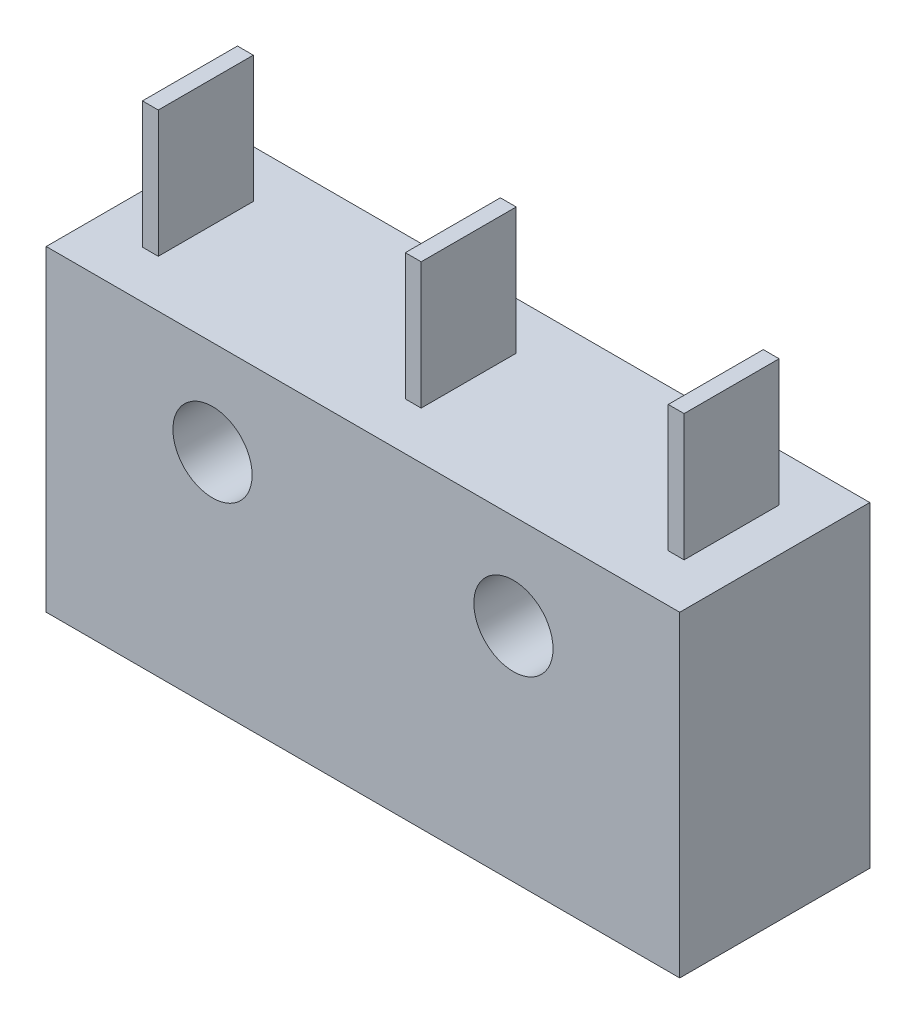
ISO-10303-21;
HEADER;
FILE_DESCRIPTION(('STEP AP214'),'2;1');
FILE_NAME('part.step','',(''),(''),'','','');
FILE_SCHEMA(('AUTOMOTIVE_DESIGN { 1 0 10303 214 1 1 1 1 }'));
ENDSEC;
DATA;
#1=APPLICATION_CONTEXT('core data for automotive mechanical design processes');
#2=APPLICATION_PROTOCOL_DEFINITION('international standard','automotive_design',2000,#1);
#3=PRODUCT_CONTEXT('',#1,'mechanical');
#4=PRODUCT('Part','Part','',(#3));
#5=PRODUCT_RELATED_PRODUCT_CATEGORY('part','',(#4));
#6=PRODUCT_DEFINITION_FORMATION('','',#4);
#7=PRODUCT_DEFINITION_CONTEXT('part definition',#1,'design');
#8=PRODUCT_DEFINITION('design','',#6,#7);
#9=PRODUCT_DEFINITION_SHAPE('','',#8);
#10=(LENGTH_UNIT() NAMED_UNIT(*) SI_UNIT(.MILLI.,.METRE.));
#11=(NAMED_UNIT(*) PLANE_ANGLE_UNIT() SI_UNIT($,.RADIAN.));
#12=(NAMED_UNIT(*) SI_UNIT($,.STERADIAN.) SOLID_ANGLE_UNIT());
#13=UNCERTAINTY_MEASURE_WITH_UNIT(LENGTH_MEASURE(1.E-05),#10,'distance_accuracy_value','');
#14=(GEOMETRIC_REPRESENTATION_CONTEXT(3) GLOBAL_UNCERTAINTY_ASSIGNED_CONTEXT((#13)) GLOBAL_UNIT_ASSIGNED_CONTEXT((#10,
#11,#12)) REPRESENTATION_CONTEXT('',''));
#15=CARTESIAN_POINT('',(0.,0.,0.));
#16=DIRECTION('',(0.,0.,1.));
#17=DIRECTION('',(1.,0.,0.));
#18=AXIS2_PLACEMENT_3D('',#15,#16,#17);
#19=CARTESIAN_POINT('',(-10.,5.,6.));
#20=DIRECTION('',(0.,-1.,0.));
#21=DIRECTION('',(0.,0.,-1.));
#22=AXIS2_PLACEMENT_3D('',#19,#20,#21);
#23=PLANE('',#22);
#24=DIRECTION('',(0.,0.,-1.));
#25=VECTOR('',#24,1.);
#26=CARTESIAN_POINT('',(0.337470845161732,5.,1.5));
#27=LINE('',#26,#25);
#28=CARTESIAN_POINT('',(0.337470845161732,5.,4.5));
#29=VERTEX_POINT('',#28);
#30=CARTESIAN_POINT('',(0.337470845161732,5.,1.5));
#31=VERTEX_POINT('',#30);
#32=EDGE_CURVE('E167',#29,#31,#27,.T.);
#33=ORIENTED_EDGE('',*,*,#32,.F.);
#34=DIRECTION('',(1.,0.,0.));
#35=VECTOR('',#34,1.);
#36=CARTESIAN_POINT('',(-0.162529154838269,5.,4.5));
#37=LINE('',#36,#35);
#38=CARTESIAN_POINT('',(-0.162529154838269,5.,4.5));
#39=VERTEX_POINT('',#38);
#40=EDGE_CURVE('E180',#39,#29,#37,.T.);
#41=ORIENTED_EDGE('',*,*,#40,.F.);
#42=DIRECTION('',(0.,0.,1.));
#43=VECTOR('',#42,1.);
#44=CARTESIAN_POINT('',(-0.162529154838269,5.,1.5));
#45=LINE('',#44,#43);
#46=CARTESIAN_POINT('',(-0.162529154838269,5.,1.5));
#47=VERTEX_POINT('',#46);
#48=EDGE_CURVE('E189',#47,#39,#45,.T.);
#49=ORIENTED_EDGE('',*,*,#48,.F.);
#50=DIRECTION('',(-1.,0.,0.));
#51=VECTOR('',#50,1.);
#52=CARTESIAN_POINT('',(-0.162529154838269,5.,1.5));
#53=LINE('',#52,#51);
#54=EDGE_CURVE('E170',#31,#47,#53,.T.);
#55=ORIENTED_EDGE('',*,*,#54,.F.);
#56=EDGE_LOOP('',(#33,#41,#49,#55));
#57=FACE_BOUND('',#56,.T.);
#58=DIRECTION('',(-1.,0.,0.));
#59=VECTOR('',#58,1.);
#60=CARTESIAN_POINT('',(-10.,5.,0.));
#61=LINE('',#60,#59);
#62=CARTESIAN_POINT('',(10.,5.,0.));
#63=VERTEX_POINT('',#62);
#64=CARTESIAN_POINT('',(-10.,5.,0.));
#65=VERTEX_POINT('',#64);
#66=EDGE_CURVE('E252',#63,#65,#61,.T.);
#67=ORIENTED_EDGE('',*,*,#66,.T.);
#68=DIRECTION('',(0.,0.,-1.));
#69=VECTOR('',#68,1.);
#70=CARTESIAN_POINT('',(-10.,5.,6.));
#71=LINE('',#70,#69);
#72=CARTESIAN_POINT('',(-10.,5.,6.));
#73=VERTEX_POINT('',#72);
#74=EDGE_CURVE('E41',#73,#65,#71,.T.);
#75=ORIENTED_EDGE('',*,*,#74,.F.);
#76=DIRECTION('',(-1.,0.,0.));
#77=VECTOR('',#76,1.);
#78=CARTESIAN_POINT('',(-10.,5.,6.));
#79=LINE('',#78,#77);
#80=CARTESIAN_POINT('',(10.,5.,6.));
#81=VERTEX_POINT('',#80);
#82=EDGE_CURVE('E242',#81,#73,#79,.T.);
#83=ORIENTED_EDGE('',*,*,#82,.F.);
#84=DIRECTION('',(0.,0.,-1.));
#85=VECTOR('',#84,1.);
#86=CARTESIAN_POINT('',(10.,5.,6.));
#87=LINE('',#86,#85);
#88=EDGE_CURVE('E11',#81,#63,#87,.T.);
#89=ORIENTED_EDGE('',*,*,#88,.T.);
#90=EDGE_LOOP('',(#67,#75,#83,#89));
#91=FACE_BOUND('',#90,.T.);
#92=DIRECTION('',(0.,0.,-1.));
#93=VECTOR('',#92,1.);
#94=CARTESIAN_POINT('',(-7.96252915483827,5.,1.5));
#95=LINE('',#94,#93);
#96=CARTESIAN_POINT('',(-7.96252915483827,5.,4.5));
#97=VERTEX_POINT('',#96);
#98=CARTESIAN_POINT('',(-7.96252915483827,5.,1.5));
#99=VERTEX_POINT('',#98);
#100=EDGE_CURVE('E205',#97,#99,#95,.T.);
#101=ORIENTED_EDGE('',*,*,#100,.F.);
#102=DIRECTION('',(1.,0.,0.));
#103=VECTOR('',#102,1.);
#104=CARTESIAN_POINT('',(-8.46252915483827,5.,4.5));
#105=LINE('',#104,#103);
#106=CARTESIAN_POINT('',(-8.46252915483827,5.,4.5));
#107=VERTEX_POINT('',#106);
#108=EDGE_CURVE('E210',#107,#97,#105,.T.);
#109=ORIENTED_EDGE('',*,*,#108,.F.);
#110=DIRECTION('',(0.,0.,1.));
#111=VECTOR('',#110,1.);
#112=CARTESIAN_POINT('',(-8.46252915483827,5.,1.5));
#113=LINE('',#112,#111);
#114=CARTESIAN_POINT('',(-8.46252915483827,5.,1.5));
#115=VERTEX_POINT('',#114);
#116=EDGE_CURVE('E222',#115,#107,#113,.T.);
#117=ORIENTED_EDGE('',*,*,#116,.F.);
#118=DIRECTION('',(-1.,0.,0.));
#119=VECTOR('',#118,1.);
#120=CARTESIAN_POINT('',(-8.46252915483827,5.,1.5));
#121=LINE('',#120,#119);
#122=EDGE_CURVE('E219',#99,#115,#121,.T.);
#123=ORIENTED_EDGE('',*,*,#122,.F.);
#124=EDGE_LOOP('',(#101,#109,#117,#123));
#125=FACE_BOUND('',#124,.T.);
#126=DIRECTION('',(0.,0.,-1.));
#127=VECTOR('',#126,1.);
#128=CARTESIAN_POINT('',(8.63747084516173,5.,1.5));
#129=LINE('',#128,#127);
#130=CARTESIAN_POINT('',(8.63747084516173,5.,4.5));
#131=VERTEX_POINT('',#130);
#132=CARTESIAN_POINT('',(8.63747084516173,5.,1.5));
#133=VERTEX_POINT('',#132);
#134=EDGE_CURVE('E166',#131,#133,#129,.T.);
#135=ORIENTED_EDGE('',*,*,#134,.F.);
#136=DIRECTION('',(1.,0.,0.));
#137=VECTOR('',#136,1.);
#138=CARTESIAN_POINT('',(8.13747084516173,5.,4.5));
#139=LINE('',#138,#137);
#140=CARTESIAN_POINT('',(8.13747084516173,5.,4.5));
#141=VERTEX_POINT('',#140);
#142=EDGE_CURVE('E163',#141,#131,#139,.T.);
#143=ORIENTED_EDGE('',*,*,#142,.F.);
#144=DIRECTION('',(0.,0.,1.));
#145=VECTOR('',#144,1.);
#146=CARTESIAN_POINT('',(8.13747084516173,5.,1.5));
#147=LINE('',#146,#145);
#148=CARTESIAN_POINT('',(8.13747084516173,5.,1.5));
#149=VERTEX_POINT('',#148);
#150=EDGE_CURVE('E53',#149,#141,#147,.T.);
#151=ORIENTED_EDGE('',*,*,#150,.F.);
#152=DIRECTION('',(-1.,0.,0.));
#153=VECTOR('',#152,1.);
#154=CARTESIAN_POINT('',(8.13747084516173,5.,1.5));
#155=LINE('',#154,#153);
#156=EDGE_CURVE('E48',#133,#149,#155,.T.);
#157=ORIENTED_EDGE('',*,*,#156,.F.);
#158=EDGE_LOOP('',(#135,#143,#151,#157));
#159=FACE_BOUND('',#158,.T.);
#160=ADVANCED_FACE('F33',(#57,#91,#125,#159),#23,.F.);
#161=CARTESIAN_POINT('',(10.,5.,6.));
#162=DIRECTION('',(-1.,0.,0.));
#163=DIRECTION('',(0.,-1.,0.));
#164=AXIS2_PLACEMENT_3D('',#161,#162,#163);
#165=PLANE('',#164);
#166=DIRECTION('',(0.,1.,0.));
#167=VECTOR('',#166,1.);
#168=CARTESIAN_POINT('',(10.,5.,0.));
#169=LINE('',#168,#167);
#170=CARTESIAN_POINT('',(10.,-5.,0.));
#171=VERTEX_POINT('',#170);
#172=EDGE_CURVE('E238',#171,#63,#169,.T.);
#173=ORIENTED_EDGE('',*,*,#172,.T.);
#174=ORIENTED_EDGE('',*,*,#88,.F.);
#175=DIRECTION('',(0.,1.,0.));
#176=VECTOR('',#175,1.);
#177=CARTESIAN_POINT('',(10.,5.,6.));
#178=LINE('',#177,#176);
#179=CARTESIAN_POINT('',(10.,-5.,6.));
#180=VERTEX_POINT('',#179);
#181=EDGE_CURVE('E239',#180,#81,#178,.T.);
#182=ORIENTED_EDGE('',*,*,#181,.F.);
#183=DIRECTION('',(0.,0.,-1.));
#184=VECTOR('',#183,1.);
#185=CARTESIAN_POINT('',(10.,-5.,6.));
#186=LINE('',#185,#184);
#187=EDGE_CURVE('E249',#180,#171,#186,.T.);
#188=ORIENTED_EDGE('',*,*,#187,.T.);
#189=EDGE_LOOP('',(#173,#174,#182,#188));
#190=FACE_BOUND('',#189,.T.);
#191=ADVANCED_FACE('F35',(#190),#165,.F.);
#192=CARTESIAN_POINT('',(-10.,5.,6.));
#193=DIRECTION('',(1.,0.,0.));
#194=DIRECTION('',(0.,1.,0.));
#195=AXIS2_PLACEMENT_3D('',#192,#193,#194);
#196=PLANE('',#195);
#197=DIRECTION('',(0.,-1.,0.));
#198=VECTOR('',#197,1.);
#199=CARTESIAN_POINT('',(-10.,5.,0.));
#200=LINE('',#199,#198);
#201=CARTESIAN_POINT('',(-9.99999999999999,-5.,0.));
#202=VERTEX_POINT('',#201);
#203=EDGE_CURVE('E254',#65,#202,#200,.T.);
#204=ORIENTED_EDGE('',*,*,#203,.T.);
#205=DIRECTION('',(0.,0.,-1.));
#206=VECTOR('',#205,1.);
#207=CARTESIAN_POINT('',(-9.99999999999999,-5.,6.));
#208=LINE('',#207,#206);
#209=CARTESIAN_POINT('',(-9.99999999999999,-5.,6.));
#210=VERTEX_POINT('',#209);
#211=EDGE_CURVE('E259',#210,#202,#208,.T.);
#212=ORIENTED_EDGE('',*,*,#211,.F.);
#213=DIRECTION('',(0.,-1.,0.));
#214=VECTOR('',#213,1.);
#215=CARTESIAN_POINT('',(-10.,5.,6.));
#216=LINE('',#215,#214);
#217=EDGE_CURVE('E245',#73,#210,#216,.T.);
#218=ORIENTED_EDGE('',*,*,#217,.F.);
#219=ORIENTED_EDGE('',*,*,#74,.T.);
#220=EDGE_LOOP('',(#204,#212,#218,#219));
#221=FACE_BOUND('',#220,.T.);
#222=ADVANCED_FACE('F266',(#221),#196,.F.);
#223=CARTESIAN_POINT('',(-9.99999999999999,-5.,6.));
#224=DIRECTION('',(0.,1.,0.));
#225=DIRECTION('',(0.,0.,1.));
#226=AXIS2_PLACEMENT_3D('',#223,#224,#225);
#227=PLANE('',#226);
#228=DIRECTION('',(1.,0.,0.));
#229=VECTOR('',#228,1.);
#230=CARTESIAN_POINT('',(-9.99999999999999,-5.,0.));
#231=LINE('',#230,#229);
#232=EDGE_CURVE('E243',#202,#171,#231,.T.);
#233=ORIENTED_EDGE('',*,*,#232,.T.);
#234=ORIENTED_EDGE('',*,*,#187,.F.);
#235=DIRECTION('',(1.,0.,0.));
#236=VECTOR('',#235,1.);
#237=CARTESIAN_POINT('',(-9.99999999999999,-5.,6.));
#238=LINE('',#237,#236);
#239=EDGE_CURVE('E247',#210,#180,#238,.T.);
#240=ORIENTED_EDGE('',*,*,#239,.F.);
#241=ORIENTED_EDGE('',*,*,#211,.T.);
#242=EDGE_LOOP('',(#233,#234,#240,#241));
#243=FACE_BOUND('',#242,.T.);
#244=ADVANCED_FACE('F275',(#243),#227,.F.);
#245=CARTESIAN_POINT('',(0.,0.,6.));
#246=DIRECTION('',(0.,0.,1.));
#247=DIRECTION('',(1.,0.,0.));
#248=AXIS2_PLACEMENT_3D('',#245,#246,#247);
#249=PLANE('',#248);
#250=CARTESIAN_POINT('',(-4.75,2.,6.));
#251=DIRECTION('',(0.,0.,1.));
#252=DIRECTION('',(1.,0.,0.));
#253=AXIS2_PLACEMENT_3D('',#250,#251,#252);
#254=CIRCLE('',#253,1.25);
#255=CARTESIAN_POINT('',(-3.5,2.,6.));
#256=VERTEX_POINT('',#255);
#257=EDGE_CURVE('E306',#256,#256,#254,.T.);
#258=ORIENTED_EDGE('',*,*,#257,.F.);
#259=EDGE_LOOP('',(#258));
#260=FACE_BOUND('',#259,.T.);
#261=CARTESIAN_POINT('',(4.75,2.,6.));
#262=DIRECTION('',(0.,0.,1.));
#263=DIRECTION('',(1.,0.,0.));
#264=AXIS2_PLACEMENT_3D('',#261,#262,#263);
#265=CIRCLE('',#264,1.25);
#266=CARTESIAN_POINT('',(6.,2.,6.));
#267=VERTEX_POINT('',#266);
#268=EDGE_CURVE('E300',#267,#267,#265,.T.);
#269=ORIENTED_EDGE('',*,*,#268,.F.);
#270=EDGE_LOOP('',(#269));
#271=FACE_BOUND('',#270,.T.);
#272=ORIENTED_EDGE('',*,*,#181,.T.);
#273=ORIENTED_EDGE('',*,*,#82,.T.);
#274=ORIENTED_EDGE('',*,*,#217,.T.);
#275=ORIENTED_EDGE('',*,*,#239,.T.);
#276=EDGE_LOOP('',(#272,#273,#274,#275));
#277=FACE_BOUND('',#276,.T.);
#278=ADVANCED_FACE('F281',(#260,#271,#277),#249,.T.);
#279=CARTESIAN_POINT('',(0.,0.,0.));
#280=DIRECTION('',(0.,0.,1.));
#281=DIRECTION('',(1.,0.,0.));
#282=AXIS2_PLACEMENT_3D('',#279,#280,#281);
#283=PLANE('',#282);
#284=CARTESIAN_POINT('',(-4.75,2.,0.));
#285=DIRECTION('',(0.,0.,1.));
#286=DIRECTION('',(1.,0.,0.));
#287=AXIS2_PLACEMENT_3D('',#284,#285,#286);
#288=CIRCLE('',#287,1.25);
#289=CARTESIAN_POINT('',(-3.5,2.,0.));
#290=VERTEX_POINT('',#289);
#291=EDGE_CURVE('E286',#290,#290,#288,.T.);
#292=ORIENTED_EDGE('',*,*,#291,.T.);
#293=EDGE_LOOP('',(#292));
#294=FACE_BOUND('',#293,.T.);
#295=CARTESIAN_POINT('',(4.75,2.,0.));
#296=DIRECTION('',(0.,0.,1.));
#297=DIRECTION('',(1.,0.,0.));
#298=AXIS2_PLACEMENT_3D('',#295,#296,#297);
#299=CIRCLE('',#298,1.25);
#300=CARTESIAN_POINT('',(6.,2.,0.));
#301=VERTEX_POINT('',#300);
#302=EDGE_CURVE('E303',#301,#301,#299,.T.);
#303=ORIENTED_EDGE('',*,*,#302,.T.);
#304=EDGE_LOOP('',(#303));
#305=FACE_BOUND('',#304,.T.);
#306=ORIENTED_EDGE('',*,*,#172,.F.);
#307=ORIENTED_EDGE('',*,*,#232,.F.);
#308=ORIENTED_EDGE('',*,*,#203,.F.);
#309=ORIENTED_EDGE('',*,*,#66,.F.);
#310=EDGE_LOOP('',(#306,#307,#308,#309));
#311=FACE_BOUND('',#310,.T.);
#312=ADVANCED_FACE('F272',(#294,#305,#311),#283,.F.);
#313=CARTESIAN_POINT('',(-7.96252915483827,9.,1.5));
#314=DIRECTION('',(-1.,0.,0.));
#315=DIRECTION('',(0.,0.,1.));
#316=AXIS2_PLACEMENT_3D('',#313,#314,#315);
#317=PLANE('',#316);
#318=ORIENTED_EDGE('',*,*,#100,.T.);
#319=DIRECTION('',(0.,-1.,0.));
#320=VECTOR('',#319,1.);
#321=CARTESIAN_POINT('',(-7.96252915483827,9.,1.5));
#322=LINE('',#321,#320);
#323=CARTESIAN_POINT('',(-7.96252915483827,9.,1.5));
#324=VERTEX_POINT('',#323);
#325=EDGE_CURVE('E235',#324,#99,#322,.T.);
#326=ORIENTED_EDGE('',*,*,#325,.F.);
#327=DIRECTION('',(0.,0.,-1.));
#328=VECTOR('',#327,1.);
#329=CARTESIAN_POINT('',(-7.96252915483827,9.,1.5));
#330=LINE('',#329,#328);
#331=CARTESIAN_POINT('',(-7.96252915483827,9.,4.5));
#332=VERTEX_POINT('',#331);
#333=EDGE_CURVE('E206',#332,#324,#330,.T.);
#334=ORIENTED_EDGE('',*,*,#333,.F.);
#335=DIRECTION('',(0.,-1.,0.));
#336=VECTOR('',#335,1.);
#337=CARTESIAN_POINT('',(-7.96252915483827,9.,4.5));
#338=LINE('',#337,#336);
#339=EDGE_CURVE('E216',#332,#97,#338,.T.);
#340=ORIENTED_EDGE('',*,*,#339,.T.);
#341=EDGE_LOOP('',(#318,#326,#334,#340));
#342=FACE_BOUND('',#341,.T.);
#343=ADVANCED_FACE('F380',(#342),#317,.F.);
#344=CARTESIAN_POINT('',(-8.46252915483827,9.,1.5));
#345=DIRECTION('',(0.,0.,1.));
#346=DIRECTION('',(1.,0.,0.));
#347=AXIS2_PLACEMENT_3D('',#344,#345,#346);
#348=PLANE('',#347);
#349=ORIENTED_EDGE('',*,*,#122,.T.);
#350=DIRECTION('',(0.,-1.,0.));
#351=VECTOR('',#350,1.);
#352=CARTESIAN_POINT('',(-8.46252915483827,9.,1.5));
#353=LINE('',#352,#351);
#354=CARTESIAN_POINT('',(-8.46252915483827,9.,1.5));
#355=VERTEX_POINT('',#354);
#356=EDGE_CURVE('E232',#355,#115,#353,.T.);
#357=ORIENTED_EDGE('',*,*,#356,.F.);
#358=DIRECTION('',(-1.,0.,0.));
#359=VECTOR('',#358,1.);
#360=CARTESIAN_POINT('',(-8.46252915483827,9.,1.5));
#361=LINE('',#360,#359);
#362=EDGE_CURVE('E209',#324,#355,#361,.T.);
#363=ORIENTED_EDGE('',*,*,#362,.F.);
#364=ORIENTED_EDGE('',*,*,#325,.T.);
#365=EDGE_LOOP('',(#349,#357,#363,#364));
#366=FACE_BOUND('',#365,.T.);
#367=ADVANCED_FACE('F376',(#366),#348,.F.);
#368=CARTESIAN_POINT('',(-8.46252915483827,9.,1.5));
#369=DIRECTION('',(1.,0.,0.));
#370=DIRECTION('',(0.,0.,-1.));
#371=AXIS2_PLACEMENT_3D('',#368,#369,#370);
#372=PLANE('',#371);
#373=ORIENTED_EDGE('',*,*,#116,.T.);
#374=DIRECTION('',(0.,-1.,0.));
#375=VECTOR('',#374,1.);
#376=CARTESIAN_POINT('',(-8.46252915483827,9.,4.5));
#377=LINE('',#376,#375);
#378=CARTESIAN_POINT('',(-8.46252915483827,9.,4.5));
#379=VERTEX_POINT('',#378);
#380=EDGE_CURVE('E229',#379,#107,#377,.T.);
#381=ORIENTED_EDGE('',*,*,#380,.F.);
#382=DIRECTION('',(0.,0.,1.));
#383=VECTOR('',#382,1.);
#384=CARTESIAN_POINT('',(-8.46252915483827,9.,1.5));
#385=LINE('',#384,#383);
#386=EDGE_CURVE('E212',#355,#379,#385,.T.);
#387=ORIENTED_EDGE('',*,*,#386,.F.);
#388=ORIENTED_EDGE('',*,*,#356,.T.);
#389=EDGE_LOOP('',(#373,#381,#387,#388));
#390=FACE_BOUND('',#389,.T.);
#391=ADVANCED_FACE('F372',(#390),#372,.F.);
#392=CARTESIAN_POINT('',(-8.46252915483827,9.,4.5));
#393=DIRECTION('',(0.,0.,-1.));
#394=DIRECTION('',(-1.,0.,0.));
#395=AXIS2_PLACEMENT_3D('',#392,#393,#394);
#396=PLANE('',#395);
#397=ORIENTED_EDGE('',*,*,#108,.T.);
#398=ORIENTED_EDGE('',*,*,#339,.F.);
#399=DIRECTION('',(1.,0.,0.));
#400=VECTOR('',#399,1.);
#401=CARTESIAN_POINT('',(-8.46252915483827,9.,4.5));
#402=LINE('',#401,#400);
#403=EDGE_CURVE('E214',#379,#332,#402,.T.);
#404=ORIENTED_EDGE('',*,*,#403,.F.);
#405=ORIENTED_EDGE('',*,*,#380,.T.);
#406=EDGE_LOOP('',(#397,#398,#404,#405));
#407=FACE_BOUND('',#406,.T.);
#408=ADVANCED_FACE('F368',(#407),#396,.F.);
#409=CARTESIAN_POINT('',(0.,9.,0.));
#410=DIRECTION('',(0.,1.,0.));
#411=DIRECTION('',(0.,0.,1.));
#412=AXIS2_PLACEMENT_3D('',#409,#410,#411);
#413=PLANE('',#412);
#414=ORIENTED_EDGE('',*,*,#333,.T.);
#415=ORIENTED_EDGE('',*,*,#362,.T.);
#416=ORIENTED_EDGE('',*,*,#386,.T.);
#417=ORIENTED_EDGE('',*,*,#403,.T.);
#418=EDGE_LOOP('',(#414,#415,#416,#417));
#419=FACE_BOUND('',#418,.T.);
#420=ADVANCED_FACE('F364',(#419),#413,.T.);
#421=CARTESIAN_POINT('',(0.337470845161732,9.,1.5));
#422=DIRECTION('',(-1.,0.,0.));
#423=DIRECTION('',(0.,0.,1.));
#424=AXIS2_PLACEMENT_3D('',#421,#422,#423);
#425=PLANE('',#424);
#426=ORIENTED_EDGE('',*,*,#32,.T.);
#427=DIRECTION('',(0.,-1.,0.));
#428=VECTOR('',#427,1.);
#429=CARTESIAN_POINT('',(0.337470845161732,9.,1.5));
#430=LINE('',#429,#428);
#431=CARTESIAN_POINT('',(0.337470845161732,9.,1.5));
#432=VERTEX_POINT('',#431);
#433=EDGE_CURVE('E202',#432,#31,#430,.T.);
#434=ORIENTED_EDGE('',*,*,#433,.F.);
#435=DIRECTION('',(0.,0.,-1.));
#436=VECTOR('',#435,1.);
#437=CARTESIAN_POINT('',(0.337470845161732,9.,1.5));
#438=LINE('',#437,#436);
#439=CARTESIAN_POINT('',(0.337470845161732,9.,4.5));
#440=VERTEX_POINT('',#439);
#441=EDGE_CURVE('E176',#440,#432,#438,.T.);
#442=ORIENTED_EDGE('',*,*,#441,.F.);
#443=DIRECTION('',(0.,-1.,0.));
#444=VECTOR('',#443,1.);
#445=CARTESIAN_POINT('',(0.337470845161732,9.,4.5));
#446=LINE('',#445,#444);
#447=EDGE_CURVE('E185',#440,#29,#446,.T.);
#448=ORIENTED_EDGE('',*,*,#447,.T.);
#449=EDGE_LOOP('',(#426,#434,#442,#448));
#450=FACE_BOUND('',#449,.T.);
#451=ADVANCED_FACE('F360',(#450),#425,.F.);
#452=CARTESIAN_POINT('',(-0.162529154838269,9.,1.5));
#453=DIRECTION('',(0.,0.,1.));
#454=DIRECTION('',(1.,0.,0.));
#455=AXIS2_PLACEMENT_3D('',#452,#453,#454);
#456=PLANE('',#455);
#457=ORIENTED_EDGE('',*,*,#54,.T.);
#458=DIRECTION('',(0.,-1.,0.));
#459=VECTOR('',#458,1.);
#460=CARTESIAN_POINT('',(-0.162529154838269,9.,1.5));
#461=LINE('',#460,#459);
#462=CARTESIAN_POINT('',(-0.162529154838269,9.,1.5));
#463=VERTEX_POINT('',#462);
#464=EDGE_CURVE('E199',#463,#47,#461,.T.);
#465=ORIENTED_EDGE('',*,*,#464,.F.);
#466=DIRECTION('',(-1.,0.,0.));
#467=VECTOR('',#466,1.);
#468=CARTESIAN_POINT('',(-0.162529154838269,9.,1.5));
#469=LINE('',#468,#467);
#470=EDGE_CURVE('E179',#432,#463,#469,.T.);
#471=ORIENTED_EDGE('',*,*,#470,.F.);
#472=ORIENTED_EDGE('',*,*,#433,.T.);
#473=EDGE_LOOP('',(#457,#465,#471,#472));
#474=FACE_BOUND('',#473,.T.);
#475=ADVANCED_FACE('F356',(#474),#456,.F.);
#476=CARTESIAN_POINT('',(-0.162529154838269,9.,1.5));
#477=DIRECTION('',(1.,0.,0.));
#478=DIRECTION('',(0.,0.,-1.));
#479=AXIS2_PLACEMENT_3D('',#476,#477,#478);
#480=PLANE('',#479);
#481=ORIENTED_EDGE('',*,*,#48,.T.);
#482=DIRECTION('',(0.,-1.,0.));
#483=VECTOR('',#482,1.);
#484=CARTESIAN_POINT('',(-0.162529154838269,9.,4.5));
#485=LINE('',#484,#483);
#486=CARTESIAN_POINT('',(-0.162529154838269,9.,4.5));
#487=VERTEX_POINT('',#486);
#488=EDGE_CURVE('E196',#487,#39,#485,.T.);
#489=ORIENTED_EDGE('',*,*,#488,.F.);
#490=DIRECTION('',(0.,0.,1.));
#491=VECTOR('',#490,1.);
#492=CARTESIAN_POINT('',(-0.162529154838269,9.,1.5));
#493=LINE('',#492,#491);
#494=EDGE_CURVE('E182',#463,#487,#493,.T.);
#495=ORIENTED_EDGE('',*,*,#494,.F.);
#496=ORIENTED_EDGE('',*,*,#464,.T.);
#497=EDGE_LOOP('',(#481,#489,#495,#496));
#498=FACE_BOUND('',#497,.T.);
#499=ADVANCED_FACE('F352',(#498),#480,.F.);
#500=CARTESIAN_POINT('',(-0.162529154838269,9.,4.5));
#501=DIRECTION('',(0.,0.,-1.));
#502=DIRECTION('',(-1.,0.,0.));
#503=AXIS2_PLACEMENT_3D('',#500,#501,#502);
#504=PLANE('',#503);
#505=ORIENTED_EDGE('',*,*,#40,.T.);
#506=ORIENTED_EDGE('',*,*,#447,.F.);
#507=DIRECTION('',(1.,0.,0.));
#508=VECTOR('',#507,1.);
#509=CARTESIAN_POINT('',(-0.162529154838269,9.,4.5));
#510=LINE('',#509,#508);
#511=EDGE_CURVE('E184',#487,#440,#510,.T.);
#512=ORIENTED_EDGE('',*,*,#511,.F.);
#513=ORIENTED_EDGE('',*,*,#488,.T.);
#514=EDGE_LOOP('',(#505,#506,#512,#513));
#515=FACE_BOUND('',#514,.T.);
#516=ADVANCED_FACE('F348',(#515),#504,.F.);
#517=CARTESIAN_POINT('',(0.,9.,0.));
#518=DIRECTION('',(0.,1.,0.));
#519=DIRECTION('',(0.,0.,1.));
#520=AXIS2_PLACEMENT_3D('',#517,#518,#519);
#521=PLANE('',#520);
#522=ORIENTED_EDGE('',*,*,#441,.T.);
#523=ORIENTED_EDGE('',*,*,#470,.T.);
#524=ORIENTED_EDGE('',*,*,#494,.T.);
#525=ORIENTED_EDGE('',*,*,#511,.T.);
#526=EDGE_LOOP('',(#522,#523,#524,#525));
#527=FACE_BOUND('',#526,.T.);
#528=ADVANCED_FACE('F345',(#527),#521,.T.);
#529=CARTESIAN_POINT('',(8.63747084516173,9.,1.5));
#530=DIRECTION('',(-1.,0.,0.));
#531=DIRECTION('',(0.,0.,1.));
#532=AXIS2_PLACEMENT_3D('',#529,#530,#531);
#533=PLANE('',#532);
#534=ORIENTED_EDGE('',*,*,#134,.T.);
#535=DIRECTION('',(0.,-1.,0.));
#536=VECTOR('',#535,1.);
#537=CARTESIAN_POINT('',(8.63747084516173,9.,1.5));
#538=LINE('',#537,#536);
#539=CARTESIAN_POINT('',(8.63747084516173,9.,1.5));
#540=VERTEX_POINT('',#539);
#541=EDGE_CURVE('E147',#540,#133,#538,.T.);
#542=ORIENTED_EDGE('',*,*,#541,.F.);
#543=DIRECTION('',(0.,0.,-1.));
#544=VECTOR('',#543,1.);
#545=CARTESIAN_POINT('',(8.63747084516173,9.,1.5));
#546=LINE('',#545,#544);
#547=CARTESIAN_POINT('',(8.63747084516173,9.,4.5));
#548=VERTEX_POINT('',#547);
#549=EDGE_CURVE('E154',#548,#540,#546,.T.);
#550=ORIENTED_EDGE('',*,*,#549,.F.);
#551=DIRECTION('',(0.,-1.,0.));
#552=VECTOR('',#551,1.);
#553=CARTESIAN_POINT('',(8.63747084516173,9.,4.5));
#554=LINE('',#553,#552);
#555=EDGE_CURVE('E291',#548,#131,#554,.T.);
#556=ORIENTED_EDGE('',*,*,#555,.T.);
#557=EDGE_LOOP('',(#534,#542,#550,#556));
#558=FACE_BOUND('',#557,.T.);
#559=ADVANCED_FACE('F165',(#558),#533,.F.);
#560=CARTESIAN_POINT('',(8.13747084516173,9.,1.5));
#561=DIRECTION('',(0.,0.,1.));
#562=DIRECTION('',(1.,0.,0.));
#563=AXIS2_PLACEMENT_3D('',#560,#561,#562);
#564=PLANE('',#563);
#565=ORIENTED_EDGE('',*,*,#156,.T.);
#566=DIRECTION('',(0.,-1.,0.));
#567=VECTOR('',#566,1.);
#568=CARTESIAN_POINT('',(8.13747084516173,9.,1.5));
#569=LINE('',#568,#567);
#570=CARTESIAN_POINT('',(8.13747084516173,9.,1.5));
#571=VERTEX_POINT('',#570);
#572=EDGE_CURVE('E150',#571,#149,#569,.T.);
#573=ORIENTED_EDGE('',*,*,#572,.F.);
#574=DIRECTION('',(-1.,0.,0.));
#575=VECTOR('',#574,1.);
#576=CARTESIAN_POINT('',(8.13747084516173,9.,1.5));
#577=LINE('',#576,#575);
#578=EDGE_CURVE('E143',#540,#571,#577,.T.);
#579=ORIENTED_EDGE('',*,*,#578,.F.);
#580=ORIENTED_EDGE('',*,*,#541,.T.);
#581=EDGE_LOOP('',(#565,#573,#579,#580));
#582=FACE_BOUND('',#581,.T.);
#583=ADVANCED_FACE('F145',(#582),#564,.F.);
#584=CARTESIAN_POINT('',(8.13747084516173,9.,1.5));
#585=DIRECTION('',(1.,0.,0.));
#586=DIRECTION('',(0.,0.,-1.));
#587=AXIS2_PLACEMENT_3D('',#584,#585,#586);
#588=PLANE('',#587);
#589=ORIENTED_EDGE('',*,*,#150,.T.);
#590=DIRECTION('',(0.,-1.,0.));
#591=VECTOR('',#590,1.);
#592=CARTESIAN_POINT('',(8.13747084516173,9.,4.5));
#593=LINE('',#592,#591);
#594=CARTESIAN_POINT('',(8.13747084516173,9.,4.5));
#595=VERTEX_POINT('',#594);
#596=EDGE_CURVE('E172',#595,#141,#593,.T.);
#597=ORIENTED_EDGE('',*,*,#596,.F.);
#598=DIRECTION('',(0.,0.,1.));
#599=VECTOR('',#598,1.);
#600=CARTESIAN_POINT('',(8.13747084516173,9.,1.5));
#601=LINE('',#600,#599);
#602=EDGE_CURVE('E153',#571,#595,#601,.T.);
#603=ORIENTED_EDGE('',*,*,#602,.F.);
#604=ORIENTED_EDGE('',*,*,#572,.T.);
#605=EDGE_LOOP('',(#589,#597,#603,#604));
#606=FACE_BOUND('',#605,.T.);
#607=ADVANCED_FACE('F337',(#606),#588,.F.);
#608=CARTESIAN_POINT('',(8.13747084516173,9.,4.5));
#609=DIRECTION('',(0.,0.,-1.));
#610=DIRECTION('',(-1.,0.,0.));
#611=AXIS2_PLACEMENT_3D('',#608,#609,#610);
#612=PLANE('',#611);
#613=ORIENTED_EDGE('',*,*,#142,.T.);
#614=ORIENTED_EDGE('',*,*,#555,.F.);
#615=DIRECTION('',(1.,0.,0.));
#616=VECTOR('',#615,1.);
#617=CARTESIAN_POINT('',(8.13747084516173,9.,4.5));
#618=LINE('',#617,#616);
#619=EDGE_CURVE('E159',#595,#548,#618,.T.);
#620=ORIENTED_EDGE('',*,*,#619,.F.);
#621=ORIENTED_EDGE('',*,*,#596,.T.);
#622=EDGE_LOOP('',(#613,#614,#620,#621));
#623=FACE_BOUND('',#622,.T.);
#624=ADVANCED_FACE('F290',(#623),#612,.F.);
#625=CARTESIAN_POINT('',(0.,9.,0.));
#626=DIRECTION('',(0.,1.,0.));
#627=DIRECTION('',(0.,0.,1.));
#628=AXIS2_PLACEMENT_3D('',#625,#626,#627);
#629=PLANE('',#628);
#630=ORIENTED_EDGE('',*,*,#549,.T.);
#631=ORIENTED_EDGE('',*,*,#578,.T.);
#632=ORIENTED_EDGE('',*,*,#602,.T.);
#633=ORIENTED_EDGE('',*,*,#619,.T.);
#634=EDGE_LOOP('',(#630,#631,#632,#633));
#635=FACE_BOUND('',#634,.T.);
#636=ADVANCED_FACE('F157',(#635),#629,.T.);
#637=CARTESIAN_POINT('',(4.75,2.,0.));
#638=DIRECTION('',(0.,0.,1.));
#639=DIRECTION('',(1.,0.,0.));
#640=AXIS2_PLACEMENT_3D('',#637,#638,#639);
#641=CYLINDRICAL_SURFACE('',#640,1.25);
#642=ORIENTED_EDGE('',*,*,#302,.F.);
#643=EDGE_LOOP('',(#642));
#644=FACE_BOUND('',#643,.T.);
#645=ORIENTED_EDGE('',*,*,#268,.T.);
#646=EDGE_LOOP('',(#645));
#647=FACE_BOUND('',#646,.T.);
#648=ADVANCED_FACE('F317',(#644,#647),#641,.F.);
#649=CARTESIAN_POINT('',(-4.75,2.,0.));
#650=DIRECTION('',(0.,0.,1.));
#651=DIRECTION('',(1.,0.,0.));
#652=AXIS2_PLACEMENT_3D('',#649,#650,#651);
#653=CYLINDRICAL_SURFACE('',#652,1.25);
#654=ORIENTED_EDGE('',*,*,#291,.F.);
#655=EDGE_LOOP('',(#654));
#656=FACE_BOUND('',#655,.T.);
#657=ORIENTED_EDGE('',*,*,#257,.T.);
#658=EDGE_LOOP('',(#657));
#659=FACE_BOUND('',#658,.T.);
#660=ADVANCED_FACE('F314',(#656,#659),#653,.F.);
#661=CLOSED_SHELL('',(#160,#191,#222,#244,#278,#312,#343,#367,#391,#408,#420,#451,#475,#499,
#516,#528,#559,#583,#607,#624,#636,#648,#660));
#662=MANIFOLD_SOLID_BREP('B2',#661);
#663=ADVANCED_BREP_SHAPE_REPRESENTATION('',(#18,#662),#14);
#664=SHAPE_DEFINITION_REPRESENTATION(#9,#663);
ENDSEC;
END-ISO-10303-21;
